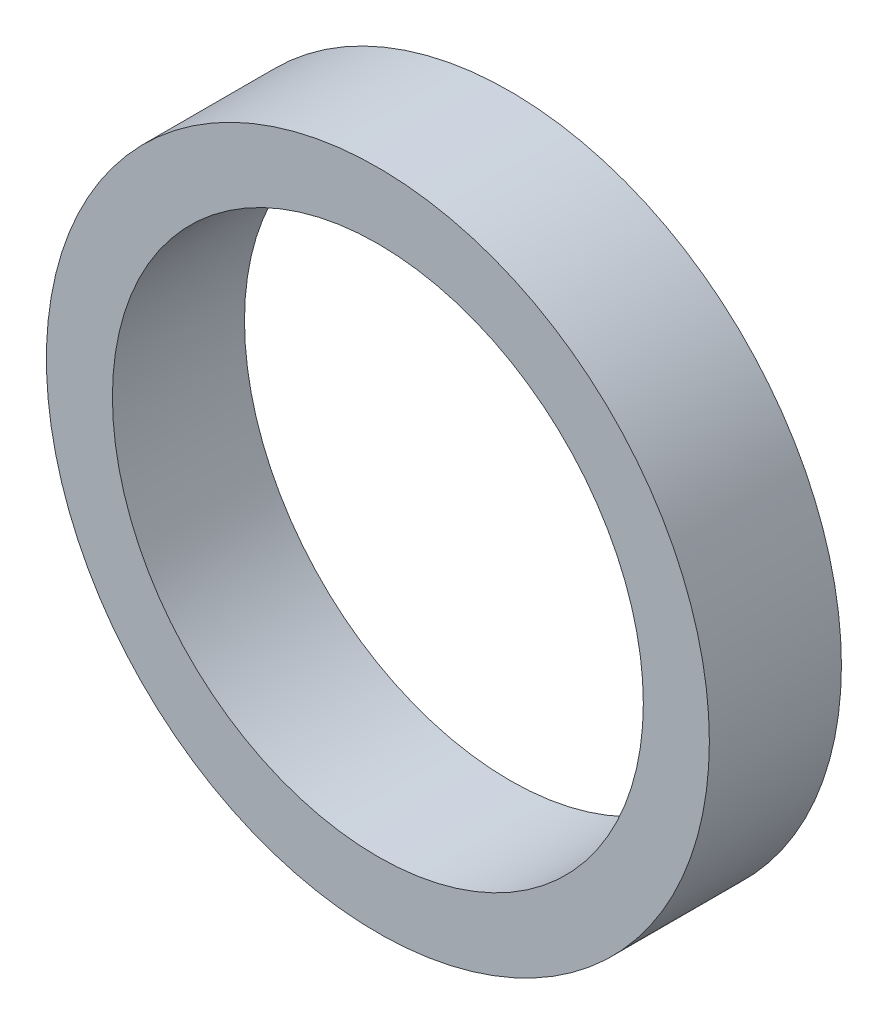
ISO-10303-21;
HEADER;
FILE_DESCRIPTION(('STEP AP214'),'2;1');
FILE_NAME('part.step','',(''),(''),'','','');
FILE_SCHEMA(('AUTOMOTIVE_DESIGN { 1 0 10303 214 1 1 1 1 }'));
ENDSEC;
DATA;
#1=APPLICATION_CONTEXT('core data for automotive mechanical design processes');
#2=APPLICATION_PROTOCOL_DEFINITION('international standard','automotive_design',2000,#1);
#3=PRODUCT_CONTEXT('',#1,'mechanical');
#4=PRODUCT('Part','Part','',(#3));
#5=PRODUCT_RELATED_PRODUCT_CATEGORY('part','',(#4));
#6=PRODUCT_DEFINITION_FORMATION('','',#4);
#7=PRODUCT_DEFINITION_CONTEXT('part definition',#1,'design');
#8=PRODUCT_DEFINITION('design','',#6,#7);
#9=PRODUCT_DEFINITION_SHAPE('','',#8);
#10=(LENGTH_UNIT() NAMED_UNIT(*) SI_UNIT(.MILLI.,.METRE.));
#11=(NAMED_UNIT(*) PLANE_ANGLE_UNIT() SI_UNIT($,.RADIAN.));
#12=(NAMED_UNIT(*) SI_UNIT($,.STERADIAN.) SOLID_ANGLE_UNIT());
#13=UNCERTAINTY_MEASURE_WITH_UNIT(LENGTH_MEASURE(1.E-05),#10,'distance_accuracy_value','');
#14=(GEOMETRIC_REPRESENTATION_CONTEXT(3) GLOBAL_UNCERTAINTY_ASSIGNED_CONTEXT((#13)) GLOBAL_UNIT_ASSIGNED_CONTEXT((#10,
#11,#12)) REPRESENTATION_CONTEXT('',''));
#15=CARTESIAN_POINT('',(0.,0.,0.));
#16=DIRECTION('',(0.,0.,1.));
#17=DIRECTION('',(1.,0.,0.));
#18=AXIS2_PLACEMENT_3D('',#15,#16,#17);
#19=CARTESIAN_POINT('',(0.,0.,5.));
#20=DIRECTION('',(0.,0.,-1.));
#21=DIRECTION('',(-1.,0.,0.));
#22=AXIS2_PLACEMENT_3D('',#19,#20,#21);
#23=CYLINDRICAL_SURFACE('',#22,12.55);
#24=CARTESIAN_POINT('',(0.,0.,5.));
#25=DIRECTION('',(0.,0.,1.));
#26=DIRECTION('',(1.,0.,0.));
#27=AXIS2_PLACEMENT_3D('',#24,#25,#26);
#28=CIRCLE('',#27,12.55);
#29=CARTESIAN_POINT('',(12.55,0.,5.));
#30=VERTEX_POINT('',#29);
#31=EDGE_CURVE('E10',#30,#30,#28,.T.);
#32=ORIENTED_EDGE('',*,*,#31,.F.);
#33=EDGE_LOOP('',(#32));
#34=FACE_BOUND('',#33,.T.);
#35=CARTESIAN_POINT('',(0.,0.,0.));
#36=DIRECTION('',(0.,0.,1.));
#37=DIRECTION('',(1.,0.,0.));
#38=AXIS2_PLACEMENT_3D('',#35,#36,#37);
#39=CIRCLE('',#38,12.55);
#40=CARTESIAN_POINT('',(12.55,0.,0.));
#41=VERTEX_POINT('',#40);
#42=EDGE_CURVE('E36',#41,#41,#39,.T.);
#43=ORIENTED_EDGE('',*,*,#42,.T.);
#44=EDGE_LOOP('',(#43));
#45=FACE_BOUND('',#44,.T.);
#46=ADVANCED_FACE('F33',(#34,#45),#23,.T.);
#47=CARTESIAN_POINT('',(0.,0.,5.));
#48=DIRECTION('',(0.,0.,1.));
#49=DIRECTION('',(1.,0.,0.));
#50=AXIS2_PLACEMENT_3D('',#47,#48,#49);
#51=PLANE('',#50);
#52=CARTESIAN_POINT('',(0.,0.,5.));
#53=DIRECTION('',(0.,0.,-1.));
#54=DIRECTION('',(-1.,0.,0.));
#55=AXIS2_PLACEMENT_3D('',#52,#53,#54);
#56=CIRCLE('',#55,10.05);
#57=CARTESIAN_POINT('',(-10.05,0.,5.));
#58=VERTEX_POINT('',#57);
#59=EDGE_CURVE('E43',#58,#58,#56,.T.);
#60=ORIENTED_EDGE('',*,*,#59,.T.);
#61=EDGE_LOOP('',(#60));
#62=FACE_BOUND('',#61,.T.);
#63=ORIENTED_EDGE('',*,*,#31,.T.);
#64=EDGE_LOOP('',(#63));
#65=FACE_BOUND('',#64,.T.);
#66=ADVANCED_FACE('F51',(#62,#65),#51,.T.);
#67=CARTESIAN_POINT('',(0.,0.,0.));
#68=DIRECTION('',(0.,0.,1.));
#69=DIRECTION('',(1.,0.,0.));
#70=AXIS2_PLACEMENT_3D('',#67,#68,#69);
#71=PLANE('',#70);
#72=CARTESIAN_POINT('',(0.,0.,0.));
#73=DIRECTION('',(0.,0.,-1.));
#74=DIRECTION('',(-1.,0.,0.));
#75=AXIS2_PLACEMENT_3D('',#72,#73,#74);
#76=CIRCLE('',#75,10.05);
#77=CARTESIAN_POINT('',(-10.05,0.,0.));
#78=VERTEX_POINT('',#77);
#79=EDGE_CURVE('E45',#78,#78,#76,.T.);
#80=ORIENTED_EDGE('',*,*,#79,.F.);
#81=EDGE_LOOP('',(#80));
#82=FACE_BOUND('',#81,.T.);
#83=ORIENTED_EDGE('',*,*,#42,.F.);
#84=EDGE_LOOP('',(#83));
#85=FACE_BOUND('',#84,.T.);
#86=ADVANCED_FACE('F56',(#82,#85),#71,.F.);
#87=CARTESIAN_POINT('',(0.,0.,5.));
#88=DIRECTION('',(0.,0.,-1.));
#89=DIRECTION('',(-1.,0.,0.));
#90=AXIS2_PLACEMENT_3D('',#87,#88,#89);
#91=CYLINDRICAL_SURFACE('',#90,10.05);
#92=ORIENTED_EDGE('',*,*,#59,.F.);
#93=EDGE_LOOP('',(#92));
#94=FACE_BOUND('',#93,.T.);
#95=ORIENTED_EDGE('',*,*,#79,.T.);
#96=EDGE_LOOP('',(#95));
#97=FACE_BOUND('',#96,.T.);
#98=ADVANCED_FACE('F53',(#94,#97),#91,.F.);
#99=CLOSED_SHELL('',(#46,#66,#86,#98));
#100=MANIFOLD_SOLID_BREP('B2',#99);
#101=ADVANCED_BREP_SHAPE_REPRESENTATION('',(#18,#100),#14);
#102=SHAPE_DEFINITION_REPRESENTATION(#9,#101);
ENDSEC;
END-ISO-10303-21;
